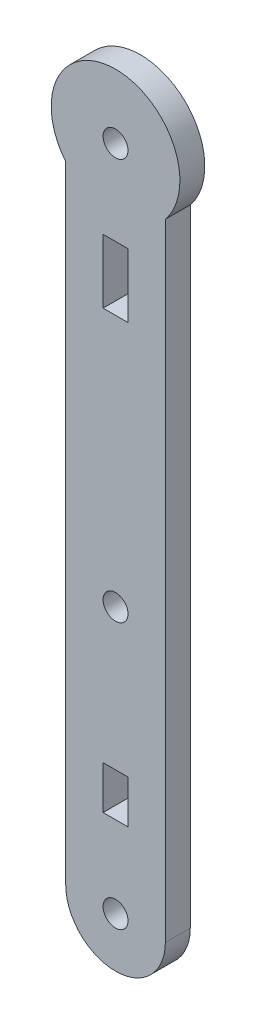
ISO-10303-21;
HEADER;
FILE_DESCRIPTION(('STEP AP214'),'2;1');
FILE_NAME('part.step','',(''),(''),'','','');
FILE_SCHEMA(('AUTOMOTIVE_DESIGN { 1 0 10303 214 1 1 1 1 }'));
ENDSEC;
DATA;
#1=APPLICATION_CONTEXT('core data for automotive mechanical design processes');
#2=APPLICATION_PROTOCOL_DEFINITION('international standard','automotive_design',2000,#1);
#3=PRODUCT_CONTEXT('',#1,'mechanical');
#4=PRODUCT('Part','Part','',(#3));
#5=PRODUCT_RELATED_PRODUCT_CATEGORY('part','',(#4));
#6=PRODUCT_DEFINITION_FORMATION('','',#4);
#7=PRODUCT_DEFINITION_CONTEXT('part definition',#1,'design');
#8=PRODUCT_DEFINITION('design','',#6,#7);
#9=PRODUCT_DEFINITION_SHAPE('','',#8);
#10=(LENGTH_UNIT() NAMED_UNIT(*) SI_UNIT(.MILLI.,.METRE.));
#11=(NAMED_UNIT(*) PLANE_ANGLE_UNIT() SI_UNIT($,.RADIAN.));
#12=(NAMED_UNIT(*) SI_UNIT($,.STERADIAN.) SOLID_ANGLE_UNIT());
#13=UNCERTAINTY_MEASURE_WITH_UNIT(LENGTH_MEASURE(1.E-05),#10,'distance_accuracy_value','');
#14=(GEOMETRIC_REPRESENTATION_CONTEXT(3) GLOBAL_UNCERTAINTY_ASSIGNED_CONTEXT((#13)) GLOBAL_UNIT_ASSIGNED_CONTEXT((#10,
#11,#12)) REPRESENTATION_CONTEXT('',''));
#15=CARTESIAN_POINT('',(0.,0.,0.));
#16=DIRECTION('',(0.,0.,1.));
#17=DIRECTION('',(1.,0.,0.));
#18=AXIS2_PLACEMENT_3D('',#15,#16,#17);
#19=CARTESIAN_POINT('',(0.,147.443292949399,3.));
#20=DIRECTION('',(0.,1.,0.));
#21=DIRECTION('',(0.,0.,1.));
#22=AXIS2_PLACEMENT_3D('',#19,#20,#21);
#23=PLANE('',#22);
#24=DIRECTION('',(1.,0.,0.));
#25=VECTOR('',#24,1.);
#26=CARTESIAN_POINT('',(0.,147.443292949399,0.));
#27=LINE('',#26,#25);
#28=CARTESIAN_POINT('',(763.896898563178,147.443292949399,0.));
#29=VERTEX_POINT('',#28);
#30=CARTESIAN_POINT('',(766.896898563178,147.443292949399,0.));
#31=VERTEX_POINT('',#30);
#32=EDGE_CURVE('E190',#29,#31,#27,.T.);
#33=ORIENTED_EDGE('',*,*,#32,.T.);
#34=DIRECTION('',(0.,0.,-1.));
#35=VECTOR('',#34,1.);
#36=CARTESIAN_POINT('',(766.896898563178,147.443292949399,3.));
#37=LINE('',#36,#35);
#38=CARTESIAN_POINT('',(766.896898563178,147.443292949399,3.));
#39=VERTEX_POINT('',#38);
#40=EDGE_CURVE('E11',#39,#31,#37,.T.);
#41=ORIENTED_EDGE('',*,*,#40,.F.);
#42=DIRECTION('',(1.,0.,0.));
#43=VECTOR('',#42,1.);
#44=CARTESIAN_POINT('',(0.,147.443292949399,3.));
#45=LINE('',#44,#43);
#46=CARTESIAN_POINT('',(763.896898563178,147.443292949399,3.));
#47=VERTEX_POINT('',#46);
#48=EDGE_CURVE('E141',#47,#39,#45,.T.);
#49=ORIENTED_EDGE('',*,*,#48,.F.);
#50=DIRECTION('',(0.,0.,-1.));
#51=VECTOR('',#50,1.);
#52=CARTESIAN_POINT('',(763.896898563178,147.443292949399,3.));
#53=LINE('',#52,#51);
#54=EDGE_CURVE('E57',#47,#29,#53,.T.);
#55=ORIENTED_EDGE('',*,*,#54,.T.);
#56=EDGE_LOOP('',(#33,#41,#49,#55));
#57=FACE_BOUND('',#56,.T.);
#58=ADVANCED_FACE('F38',(#57),#23,.F.);
#59=CARTESIAN_POINT('',(766.896898563178,0.,3.));
#60=DIRECTION('',(1.,0.,0.));
#61=DIRECTION('',(0.,0.,-1.));
#62=AXIS2_PLACEMENT_3D('',#59,#60,#61);
#63=PLANE('',#62);
#64=DIRECTION('',(0.,-1.,0.));
#65=VECTOR('',#64,1.);
#66=CARTESIAN_POINT('',(766.896898563178,0.,0.));
#67=LINE('',#66,#65);
#68=CARTESIAN_POINT('',(766.896898563178,142.243292949399,0.));
#69=VERTEX_POINT('',#68);
#70=EDGE_CURVE('E147',#31,#69,#67,.T.);
#71=ORIENTED_EDGE('',*,*,#70,.T.);
#72=DIRECTION('',(0.,0.,-1.));
#73=VECTOR('',#72,1.);
#74=CARTESIAN_POINT('',(766.896898563178,142.243292949399,3.));
#75=LINE('',#74,#73);
#76=CARTESIAN_POINT('',(766.896898563178,142.243292949399,3.));
#77=VERTEX_POINT('',#76);
#78=EDGE_CURVE('E48',#77,#69,#75,.T.);
#79=ORIENTED_EDGE('',*,*,#78,.F.);
#80=DIRECTION('',(0.,-1.,0.));
#81=VECTOR('',#80,1.);
#82=CARTESIAN_POINT('',(766.896898563178,0.,3.));
#83=LINE('',#82,#81);
#84=EDGE_CURVE('E135',#39,#77,#83,.T.);
#85=ORIENTED_EDGE('',*,*,#84,.F.);
#86=ORIENTED_EDGE('',*,*,#40,.T.);
#87=EDGE_LOOP('',(#71,#79,#85,#86));
#88=FACE_BOUND('',#87,.T.);
#89=ADVANCED_FACE('F146',(#88),#63,.F.);
#90=CARTESIAN_POINT('',(0.,142.243292949399,3.));
#91=DIRECTION('',(0.,1.,0.));
#92=DIRECTION('',(0.,0.,1.));
#93=AXIS2_PLACEMENT_3D('',#90,#91,#92);
#94=PLANE('',#93);
#95=DIRECTION('',(1.,0.,0.));
#96=VECTOR('',#95,1.);
#97=CARTESIAN_POINT('',(0.,142.243292949399,0.));
#98=LINE('',#97,#96);
#99=CARTESIAN_POINT('',(763.896898563178,142.243292949399,0.));
#100=VERTEX_POINT('',#99);
#101=EDGE_CURVE('E193',#100,#69,#98,.T.);
#102=ORIENTED_EDGE('',*,*,#101,.F.);
#103=DIRECTION('',(0.,0.,-1.));
#104=VECTOR('',#103,1.);
#105=CARTESIAN_POINT('',(763.896898563178,142.243292949399,3.));
#106=LINE('',#105,#104);
#107=CARTESIAN_POINT('',(763.896898563178,142.243292949399,3.));
#108=VERTEX_POINT('',#107);
#109=EDGE_CURVE('E95',#108,#100,#106,.T.);
#110=ORIENTED_EDGE('',*,*,#109,.F.);
#111=DIRECTION('',(1.,0.,0.));
#112=VECTOR('',#111,1.);
#113=CARTESIAN_POINT('',(0.,142.243292949399,3.));
#114=LINE('',#113,#112);
#115=EDGE_CURVE('E140',#108,#77,#114,.T.);
#116=ORIENTED_EDGE('',*,*,#115,.T.);
#117=ORIENTED_EDGE('',*,*,#78,.T.);
#118=EDGE_LOOP('',(#102,#110,#116,#117));
#119=FACE_BOUND('',#118,.T.);
#120=ADVANCED_FACE('F151',(#119),#94,.T.);
#121=CARTESIAN_POINT('',(0.,202.543292949399,3.));
#122=DIRECTION('',(0.,1.,0.));
#123=DIRECTION('',(0.,0.,1.));
#124=AXIS2_PLACEMENT_3D('',#121,#122,#123);
#125=PLANE('',#124);
#126=DIRECTION('',(1.,0.,0.));
#127=VECTOR('',#126,1.);
#128=CARTESIAN_POINT('',(0.,202.543292949399,0.));
#129=LINE('',#128,#127);
#130=CARTESIAN_POINT('',(763.896898563178,202.543292949399,0.));
#131=VERTEX_POINT('',#130);
#132=CARTESIAN_POINT('',(766.896898563178,202.543292949399,0.));
#133=VERTEX_POINT('',#132);
#134=EDGE_CURVE('E178',#131,#133,#129,.T.);
#135=ORIENTED_EDGE('',*,*,#134,.T.);
#136=DIRECTION('',(0.,0.,-1.));
#137=VECTOR('',#136,1.);
#138=CARTESIAN_POINT('',(766.896898563178,202.543292949399,3.));
#139=LINE('',#138,#137);
#140=CARTESIAN_POINT('',(766.896898563178,202.543292949399,3.));
#141=VERTEX_POINT('',#140);
#142=EDGE_CURVE('E200',#141,#133,#139,.T.);
#143=ORIENTED_EDGE('',*,*,#142,.F.);
#144=DIRECTION('',(1.,0.,0.));
#145=VECTOR('',#144,1.);
#146=CARTESIAN_POINT('',(0.,202.543292949399,3.));
#147=LINE('',#146,#145);
#148=CARTESIAN_POINT('',(763.896898563178,202.543292949399,3.));
#149=VERTEX_POINT('',#148);
#150=EDGE_CURVE('E249',#149,#141,#147,.T.);
#151=ORIENTED_EDGE('',*,*,#150,.F.);
#152=DIRECTION('',(0.,0.,-1.));
#153=VECTOR('',#152,1.);
#154=CARTESIAN_POINT('',(763.896898563178,202.543292949399,3.));
#155=LINE('',#154,#153);
#156=EDGE_CURVE('E202',#149,#131,#155,.T.);
#157=ORIENTED_EDGE('',*,*,#156,.T.);
#158=EDGE_LOOP('',(#135,#143,#151,#157));
#159=FACE_BOUND('',#158,.T.);
#160=ADVANCED_FACE('F275',(#159),#125,.F.);
#161=CARTESIAN_POINT('',(766.896898563178,0.,3.));
#162=DIRECTION('',(1.,0.,0.));
#163=DIRECTION('',(0.,0.,-1.));
#164=AXIS2_PLACEMENT_3D('',#161,#162,#163);
#165=PLANE('',#164);
#166=DIRECTION('',(0.,-1.,0.));
#167=VECTOR('',#166,1.);
#168=CARTESIAN_POINT('',(766.896898563178,0.,0.));
#169=LINE('',#168,#167);
#170=CARTESIAN_POINT('',(766.896898563178,194.843292949399,0.));
#171=VERTEX_POINT('',#170);
#172=EDGE_CURVE('E181',#133,#171,#169,.T.);
#173=ORIENTED_EDGE('',*,*,#172,.T.);
#174=DIRECTION('',(0.,0.,-1.));
#175=VECTOR('',#174,1.);
#176=CARTESIAN_POINT('',(766.896898563178,194.843292949399,3.));
#177=LINE('',#176,#175);
#178=CARTESIAN_POINT('',(766.896898563178,194.843292949399,3.));
#179=VERTEX_POINT('',#178);
#180=EDGE_CURVE('E206',#179,#171,#177,.T.);
#181=ORIENTED_EDGE('',*,*,#180,.F.);
#182=DIRECTION('',(0.,-1.,0.));
#183=VECTOR('',#182,1.);
#184=CARTESIAN_POINT('',(766.896898563178,0.,3.));
#185=LINE('',#184,#183);
#186=EDGE_CURVE('E252',#141,#179,#185,.T.);
#187=ORIENTED_EDGE('',*,*,#186,.F.);
#188=ORIENTED_EDGE('',*,*,#142,.T.);
#189=EDGE_LOOP('',(#173,#181,#187,#188));
#190=FACE_BOUND('',#189,.T.);
#191=ADVANCED_FACE('F277',(#190),#165,.F.);
#192=CARTESIAN_POINT('',(0.,194.843292949399,3.));
#193=DIRECTION('',(0.,1.,0.));
#194=DIRECTION('',(0.,0.,1.));
#195=AXIS2_PLACEMENT_3D('',#192,#193,#194);
#196=PLANE('',#195);
#197=DIRECTION('',(1.,0.,0.));
#198=VECTOR('',#197,1.);
#199=CARTESIAN_POINT('',(0.,194.843292949399,0.));
#200=LINE('',#199,#198);
#201=CARTESIAN_POINT('',(763.896898563178,194.843292949399,0.));
#202=VERTEX_POINT('',#201);
#203=EDGE_CURVE('E184',#202,#171,#200,.T.);
#204=ORIENTED_EDGE('',*,*,#203,.F.);
#205=DIRECTION('',(0.,0.,-1.));
#206=VECTOR('',#205,1.);
#207=CARTESIAN_POINT('',(763.896898563178,194.843292949399,3.));
#208=LINE('',#207,#206);
#209=CARTESIAN_POINT('',(763.896898563178,194.843292949399,3.));
#210=VERTEX_POINT('',#209);
#211=EDGE_CURVE('E204',#210,#202,#208,.T.);
#212=ORIENTED_EDGE('',*,*,#211,.F.);
#213=DIRECTION('',(1.,0.,0.));
#214=VECTOR('',#213,1.);
#215=CARTESIAN_POINT('',(0.,194.843292949399,3.));
#216=LINE('',#215,#214);
#217=EDGE_CURVE('E254',#210,#179,#216,.T.);
#218=ORIENTED_EDGE('',*,*,#217,.T.);
#219=ORIENTED_EDGE('',*,*,#180,.T.);
#220=EDGE_LOOP('',(#204,#212,#218,#219));
#221=FACE_BOUND('',#220,.T.);
#222=ADVANCED_FACE('F270',(#221),#196,.T.);
#223=CARTESIAN_POINT('',(765.396898563178,132.443292949399,3.));
#224=DIRECTION('',(0.,0.,-1.));
#225=DIRECTION('',(-1.,0.,0.));
#226=AXIS2_PLACEMENT_3D('',#223,#224,#225);
#227=CYLINDRICAL_SURFACE('',#226,6.00000000000001);
#228=CARTESIAN_POINT('',(765.396898563178,132.443292949399,0.));
#229=DIRECTION('',(0.,0.,1.));
#230=DIRECTION('',(1.,0.,0.));
#231=AXIS2_PLACEMENT_3D('',#228,#229,#230);
#232=CIRCLE('',#231,6.00000000000001);
#233=CARTESIAN_POINT('',(771.396898563178,132.443292949399,0.));
#234=VERTEX_POINT('',#233);
#235=CARTESIAN_POINT('',(759.396898563178,132.443292949399,0.));
#236=VERTEX_POINT('',#235);
#237=EDGE_CURVE('E158',#234,#236,#232,.F.);
#238=ORIENTED_EDGE('',*,*,#237,.F.);
#239=DIRECTION('',(0.,0.,-1.));
#240=VECTOR('',#239,1.);
#241=CARTESIAN_POINT('',(771.396898563178,132.443292949399,3.));
#242=LINE('',#241,#240);
#243=CARTESIAN_POINT('',(771.396898563178,132.443292949399,3.));
#244=VERTEX_POINT('',#243);
#245=EDGE_CURVE('E42',#244,#234,#242,.T.);
#246=ORIENTED_EDGE('',*,*,#245,.F.);
#247=CARTESIAN_POINT('',(765.396898563178,132.443292949399,3.));
#248=DIRECTION('',(0.,0.,1.));
#249=DIRECTION('',(1.,0.,0.));
#250=AXIS2_PLACEMENT_3D('',#247,#248,#249);
#251=CIRCLE('',#250,6.00000000000001);
#252=CARTESIAN_POINT('',(759.396898563178,132.443292949399,3.));
#253=VERTEX_POINT('',#252);
#254=EDGE_CURVE('E198',#244,#253,#251,.F.);
#255=ORIENTED_EDGE('',*,*,#254,.T.);
#256=DIRECTION('',(0.,0.,-1.));
#257=VECTOR('',#256,1.);
#258=CARTESIAN_POINT('',(759.396898563178,132.443292949399,3.));
#259=LINE('',#258,#257);
#260=EDGE_CURVE('E154',#253,#236,#259,.T.);
#261=ORIENTED_EDGE('',*,*,#260,.T.);
#262=EDGE_LOOP('',(#238,#246,#255,#261));
#263=FACE_BOUND('',#262,.T.);
#264=ADVANCED_FACE('F40',(#263),#227,.T.);
#265=CARTESIAN_POINT('',(771.396898563178,0.,3.));
#266=DIRECTION('',(1.,0.,0.));
#267=DIRECTION('',(0.,0.,-1.));
#268=AXIS2_PLACEMENT_3D('',#265,#266,#267);
#269=PLANE('',#268);
#270=DIRECTION('',(0.,-1.,0.));
#271=VECTOR('',#270,1.);
#272=CARTESIAN_POINT('',(771.396898563178,0.,0.));
#273=LINE('',#272,#271);
#274=CARTESIAN_POINT('',(771.396898563178,207.866304389872,0.));
#275=VERTEX_POINT('',#274);
#276=EDGE_CURVE('E161',#275,#234,#273,.T.);
#277=ORIENTED_EDGE('',*,*,#276,.F.);
#278=DIRECTION('',(0.,0.,-1.));
#279=VECTOR('',#278,1.);
#280=CARTESIAN_POINT('',(771.396898563178,207.866304389872,3.));
#281=LINE('',#280,#279);
#282=CARTESIAN_POINT('',(771.396898563178,207.866304389872,3.));
#283=VERTEX_POINT('',#282);
#284=EDGE_CURVE('E213',#283,#275,#281,.T.);
#285=ORIENTED_EDGE('',*,*,#284,.F.);
#286=DIRECTION('',(0.,-1.,0.));
#287=VECTOR('',#286,1.);
#288=CARTESIAN_POINT('',(771.396898563178,0.,3.));
#289=LINE('',#288,#287);
#290=EDGE_CURVE('E222',#283,#244,#289,.T.);
#291=ORIENTED_EDGE('',*,*,#290,.T.);
#292=ORIENTED_EDGE('',*,*,#245,.T.);
#293=EDGE_LOOP('',(#277,#285,#291,#292));
#294=FACE_BOUND('',#293,.T.);
#295=ADVANCED_FACE('F220',(#294),#269,.T.);
#296=CARTESIAN_POINT('',(765.396898563178,212.77165860746,3.));
#297=DIRECTION('',(0.,0.,-1.));
#298=DIRECTION('',(-1.,0.,0.));
#299=AXIS2_PLACEMENT_3D('',#296,#297,#298);
#300=CYLINDRICAL_SURFACE('',#299,7.75000000000007);
#301=CARTESIAN_POINT('',(765.396898563178,212.77165860746,0.));
#302=DIRECTION('',(0.,0.,1.));
#303=DIRECTION('',(1.,0.,0.));
#304=AXIS2_PLACEMENT_3D('',#301,#302,#303);
#305=CIRCLE('',#304,7.75000000000007);
#306=CARTESIAN_POINT('',(759.396898563178,207.866304389872,0.));
#307=VERTEX_POINT('',#306);
#308=EDGE_CURVE('E164',#275,#307,#305,.T.);
#309=ORIENTED_EDGE('',*,*,#308,.T.);
#310=DIRECTION('',(0.,0.,-1.));
#311=VECTOR('',#310,1.);
#312=CARTESIAN_POINT('',(759.396898563178,207.866304389872,3.));
#313=LINE('',#312,#311);
#314=CARTESIAN_POINT('',(759.396898563178,207.866304389872,3.));
#315=VERTEX_POINT('',#314);
#316=EDGE_CURVE('E211',#315,#307,#313,.T.);
#317=ORIENTED_EDGE('',*,*,#316,.F.);
#318=CARTESIAN_POINT('',(765.396898563178,212.77165860746,3.));
#319=DIRECTION('',(0.,0.,1.));
#320=DIRECTION('',(1.,0.,0.));
#321=AXIS2_PLACEMENT_3D('',#318,#319,#320);
#322=CIRCLE('',#321,7.75000000000007);
#323=EDGE_CURVE('E236',#283,#315,#322,.T.);
#324=ORIENTED_EDGE('',*,*,#323,.F.);
#325=ORIENTED_EDGE('',*,*,#284,.T.);
#326=EDGE_LOOP('',(#309,#317,#324,#325));
#327=FACE_BOUND('',#326,.T.);
#328=ADVANCED_FACE('F229',(#327),#300,.T.);
#329=CARTESIAN_POINT('',(763.896898563178,0.,3.));
#330=DIRECTION('',(1.,0.,0.));
#331=DIRECTION('',(0.,0.,-1.));
#332=AXIS2_PLACEMENT_3D('',#329,#330,#331);
#333=PLANE('',#332);
#334=DIRECTION('',(0.,-1.,0.));
#335=VECTOR('',#334,1.);
#336=CARTESIAN_POINT('',(763.896898563178,0.,0.));
#337=LINE('',#336,#335);
#338=EDGE_CURVE('E187',#131,#202,#337,.T.);
#339=ORIENTED_EDGE('',*,*,#338,.F.);
#340=ORIENTED_EDGE('',*,*,#156,.F.);
#341=DIRECTION('',(0.,-1.,0.));
#342=VECTOR('',#341,1.);
#343=CARTESIAN_POINT('',(763.896898563178,0.,3.));
#344=LINE('',#343,#342);
#345=EDGE_CURVE('E257',#149,#210,#344,.T.);
#346=ORIENTED_EDGE('',*,*,#345,.T.);
#347=ORIENTED_EDGE('',*,*,#211,.T.);
#348=EDGE_LOOP('',(#339,#340,#346,#347));
#349=FACE_BOUND('',#348,.T.);
#350=ADVANCED_FACE('F262',(#349),#333,.T.);
#351=CARTESIAN_POINT('',(765.396898563178,212.77165860746,3.));
#352=DIRECTION('',(0.,0.,-1.));
#353=DIRECTION('',(-1.,0.,0.));
#354=AXIS2_PLACEMENT_3D('',#351,#352,#353);
#355=CYLINDRICAL_SURFACE('',#354,1.49999999999996);
#356=CARTESIAN_POINT('',(765.396898563178,212.77165860746,3.));
#357=DIRECTION('',(0.,0.,1.));
#358=DIRECTION('',(1.,0.,0.));
#359=AXIS2_PLACEMENT_3D('',#356,#357,#358);
#360=CIRCLE('',#359,1.49999999999996);
#361=CARTESIAN_POINT('',(766.896898563178,212.77165860746,3.));
#362=VERTEX_POINT('',#361);
#363=EDGE_CURVE('E246',#362,#362,#360,.T.);
#364=ORIENTED_EDGE('',*,*,#363,.T.);
#365=EDGE_LOOP('',(#364));
#366=FACE_BOUND('',#365,.T.);
#367=CARTESIAN_POINT('',(765.396898563178,212.77165860746,0.));
#368=DIRECTION('',(0.,0.,1.));
#369=DIRECTION('',(1.,0.,0.));
#370=AXIS2_PLACEMENT_3D('',#367,#368,#369);
#371=CIRCLE('',#370,1.49999999999996);
#372=CARTESIAN_POINT('',(766.896898563178,212.77165860746,0.));
#373=VERTEX_POINT('',#372);
#374=EDGE_CURVE('E175',#373,#373,#371,.T.);
#375=ORIENTED_EDGE('',*,*,#374,.F.);
#376=EDGE_LOOP('',(#375));
#377=FACE_BOUND('',#376,.T.);
#378=ADVANCED_FACE('F295',(#366,#377),#355,.F.);
#379=CARTESIAN_POINT('',(765.396898563178,164.443292949399,3.));
#380=DIRECTION('',(0.,0.,-1.));
#381=DIRECTION('',(-1.,0.,0.));
#382=AXIS2_PLACEMENT_3D('',#379,#380,#381);
#383=CYLINDRICAL_SURFACE('',#382,1.49999999999996);
#384=CARTESIAN_POINT('',(765.396898563178,164.443292949399,3.));
#385=DIRECTION('',(0.,0.,1.));
#386=DIRECTION('',(1.,0.,0.));
#387=AXIS2_PLACEMENT_3D('',#384,#385,#386);
#388=CIRCLE('',#387,1.49999999999996);
#389=CARTESIAN_POINT('',(766.896898563178,164.443292949399,3.));
#390=VERTEX_POINT('',#389);
#391=EDGE_CURVE('E239',#390,#390,#388,.T.);
#392=ORIENTED_EDGE('',*,*,#391,.T.);
#393=EDGE_LOOP('',(#392));
#394=FACE_BOUND('',#393,.T.);
#395=CARTESIAN_POINT('',(765.396898563178,164.443292949399,0.));
#396=DIRECTION('',(0.,0.,1.));
#397=DIRECTION('',(1.,0.,0.));
#398=AXIS2_PLACEMENT_3D('',#395,#396,#397);
#399=CIRCLE('',#398,1.49999999999996);
#400=CARTESIAN_POINT('',(766.896898563178,164.443292949399,0.));
#401=VERTEX_POINT('',#400);
#402=EDGE_CURVE('E172',#401,#401,#399,.T.);
#403=ORIENTED_EDGE('',*,*,#402,.F.);
#404=EDGE_LOOP('',(#403));
#405=FACE_BOUND('',#404,.T.);
#406=ADVANCED_FACE('F300',(#394,#405),#383,.F.);
#407=CARTESIAN_POINT('',(765.396898563178,132.443292949399,3.));
#408=DIRECTION('',(0.,0.,-1.));
#409=DIRECTION('',(-1.,0.,0.));
#410=AXIS2_PLACEMENT_3D('',#407,#408,#409);
#411=CYLINDRICAL_SURFACE('',#410,1.49999999999996);
#412=CARTESIAN_POINT('',(765.396898563178,132.443292949399,3.));
#413=DIRECTION('',(0.,0.,1.));
#414=DIRECTION('',(1.,0.,0.));
#415=AXIS2_PLACEMENT_3D('',#412,#413,#414);
#416=CIRCLE('',#415,1.49999999999996);
#417=CARTESIAN_POINT('',(766.896898563178,132.443292949399,3.));
#418=VERTEX_POINT('',#417);
#419=EDGE_CURVE('E235',#418,#418,#416,.T.);
#420=ORIENTED_EDGE('',*,*,#419,.T.);
#421=EDGE_LOOP('',(#420));
#422=FACE_BOUND('',#421,.T.);
#423=CARTESIAN_POINT('',(765.396898563178,132.443292949399,0.));
#424=DIRECTION('',(0.,0.,1.));
#425=DIRECTION('',(1.,0.,0.));
#426=AXIS2_PLACEMENT_3D('',#423,#424,#425);
#427=CIRCLE('',#426,1.49999999999996);
#428=CARTESIAN_POINT('',(766.896898563178,132.443292949399,0.));
#429=VERTEX_POINT('',#428);
#430=EDGE_CURVE('E169',#429,#429,#427,.T.);
#431=ORIENTED_EDGE('',*,*,#430,.F.);
#432=EDGE_LOOP('',(#431));
#433=FACE_BOUND('',#432,.T.);
#434=ADVANCED_FACE('F311',(#422,#433),#411,.F.);
#435=CARTESIAN_POINT('',(759.396898563178,0.,3.));
#436=DIRECTION('',(1.,0.,0.));
#437=DIRECTION('',(0.,0.,-1.));
#438=AXIS2_PLACEMENT_3D('',#435,#436,#437);
#439=PLANE('',#438);
#440=DIRECTION('',(0.,-1.,0.));
#441=VECTOR('',#440,1.);
#442=CARTESIAN_POINT('',(759.396898563178,0.,0.));
#443=LINE('',#442,#441);
#444=EDGE_CURVE('E166',#307,#236,#443,.T.);
#445=ORIENTED_EDGE('',*,*,#444,.T.);
#446=ORIENTED_EDGE('',*,*,#260,.F.);
#447=DIRECTION('',(0.,-1.,0.));
#448=VECTOR('',#447,1.);
#449=CARTESIAN_POINT('',(759.396898563178,0.,3.));
#450=LINE('',#449,#448);
#451=EDGE_CURVE('E233',#315,#253,#450,.T.);
#452=ORIENTED_EDGE('',*,*,#451,.F.);
#453=ORIENTED_EDGE('',*,*,#316,.T.);
#454=EDGE_LOOP('',(#445,#446,#452,#453));
#455=FACE_BOUND('',#454,.T.);
#456=ADVANCED_FACE('F232',(#455),#439,.F.);
#457=CARTESIAN_POINT('',(763.896898563178,0.,3.));
#458=DIRECTION('',(1.,0.,0.));
#459=DIRECTION('',(0.,0.,-1.));
#460=AXIS2_PLACEMENT_3D('',#457,#458,#459);
#461=PLANE('',#460);
#462=DIRECTION('',(0.,-1.,0.));
#463=VECTOR('',#462,1.);
#464=CARTESIAN_POINT('',(763.896898563178,0.,0.));
#465=LINE('',#464,#463);
#466=EDGE_CURVE('E195',#29,#100,#465,.T.);
#467=ORIENTED_EDGE('',*,*,#466,.F.);
#468=ORIENTED_EDGE('',*,*,#54,.F.);
#469=DIRECTION('',(0.,-1.,0.));
#470=VECTOR('',#469,1.);
#471=CARTESIAN_POINT('',(763.896898563178,0.,3.));
#472=LINE('',#471,#470);
#473=EDGE_CURVE('E152',#47,#108,#472,.T.);
#474=ORIENTED_EDGE('',*,*,#473,.T.);
#475=ORIENTED_EDGE('',*,*,#109,.T.);
#476=EDGE_LOOP('',(#467,#468,#474,#475));
#477=FACE_BOUND('',#476,.T.);
#478=ADVANCED_FACE('F310',(#477),#461,.T.);
#479=CARTESIAN_POINT('',(0.,0.,3.));
#480=DIRECTION('',(0.,0.,1.));
#481=DIRECTION('',(1.,0.,0.));
#482=AXIS2_PLACEMENT_3D('',#479,#480,#481);
#483=PLANE('',#482);
#484=ORIENTED_EDGE('',*,*,#254,.F.);
#485=ORIENTED_EDGE('',*,*,#290,.F.);
#486=ORIENTED_EDGE('',*,*,#323,.T.);
#487=ORIENTED_EDGE('',*,*,#451,.T.);
#488=EDGE_LOOP('',(#484,#485,#486,#487));
#489=FACE_BOUND('',#488,.T.);
#490=ORIENTED_EDGE('',*,*,#419,.F.);
#491=EDGE_LOOP('',(#490));
#492=FACE_BOUND('',#491,.T.);
#493=ORIENTED_EDGE('',*,*,#391,.F.);
#494=EDGE_LOOP('',(#493));
#495=FACE_BOUND('',#494,.T.);
#496=ORIENTED_EDGE('',*,*,#363,.F.);
#497=EDGE_LOOP('',(#496));
#498=FACE_BOUND('',#497,.T.);
#499=ORIENTED_EDGE('',*,*,#150,.T.);
#500=ORIENTED_EDGE('',*,*,#186,.T.);
#501=ORIENTED_EDGE('',*,*,#217,.F.);
#502=ORIENTED_EDGE('',*,*,#345,.F.);
#503=EDGE_LOOP('',(#499,#500,#501,#502));
#504=FACE_BOUND('',#503,.T.);
#505=ORIENTED_EDGE('',*,*,#48,.T.);
#506=ORIENTED_EDGE('',*,*,#84,.T.);
#507=ORIENTED_EDGE('',*,*,#115,.F.);
#508=ORIENTED_EDGE('',*,*,#473,.F.);
#509=EDGE_LOOP('',(#505,#506,#507,#508));
#510=FACE_BOUND('',#509,.T.);
#511=ADVANCED_FACE('F137',(#489,#492,#495,#498,#504,#510),#483,.T.);
#512=CARTESIAN_POINT('',(0.,0.,0.));
#513=DIRECTION('',(0.,0.,1.));
#514=DIRECTION('',(1.,0.,0.));
#515=AXIS2_PLACEMENT_3D('',#512,#513,#514);
#516=PLANE('',#515);
#517=ORIENTED_EDGE('',*,*,#237,.T.);
#518=ORIENTED_EDGE('',*,*,#444,.F.);
#519=ORIENTED_EDGE('',*,*,#308,.F.);
#520=ORIENTED_EDGE('',*,*,#276,.T.);
#521=EDGE_LOOP('',(#517,#518,#519,#520));
#522=FACE_BOUND('',#521,.T.);
#523=ORIENTED_EDGE('',*,*,#430,.T.);
#524=EDGE_LOOP('',(#523));
#525=FACE_BOUND('',#524,.T.);
#526=ORIENTED_EDGE('',*,*,#402,.T.);
#527=EDGE_LOOP('',(#526));
#528=FACE_BOUND('',#527,.T.);
#529=ORIENTED_EDGE('',*,*,#374,.T.);
#530=EDGE_LOOP('',(#529));
#531=FACE_BOUND('',#530,.T.);
#532=ORIENTED_EDGE('',*,*,#134,.F.);
#533=ORIENTED_EDGE('',*,*,#338,.T.);
#534=ORIENTED_EDGE('',*,*,#203,.T.);
#535=ORIENTED_EDGE('',*,*,#172,.F.);
#536=EDGE_LOOP('',(#532,#533,#534,#535));
#537=FACE_BOUND('',#536,.T.);
#538=ORIENTED_EDGE('',*,*,#32,.F.);
#539=ORIENTED_EDGE('',*,*,#466,.T.);
#540=ORIENTED_EDGE('',*,*,#101,.T.);
#541=ORIENTED_EDGE('',*,*,#70,.F.);
#542=EDGE_LOOP('',(#538,#539,#540,#541));
#543=FACE_BOUND('',#542,.T.);
#544=ADVANCED_FACE('F226',(#522,#525,#528,#531,#537,#543),#516,.F.);
#545=CLOSED_SHELL('',(#58,#89,#120,#160,#191,#222,#264,#295,#328,#350,#378,#406,#434,#456,#478,
#511,#544));
#546=MANIFOLD_SOLID_BREP('B2',#545);
#547=ADVANCED_BREP_SHAPE_REPRESENTATION('',(#18,#546),#14);
#548=SHAPE_DEFINITION_REPRESENTATION(#9,#547);
ENDSEC;
END-ISO-10303-21;
